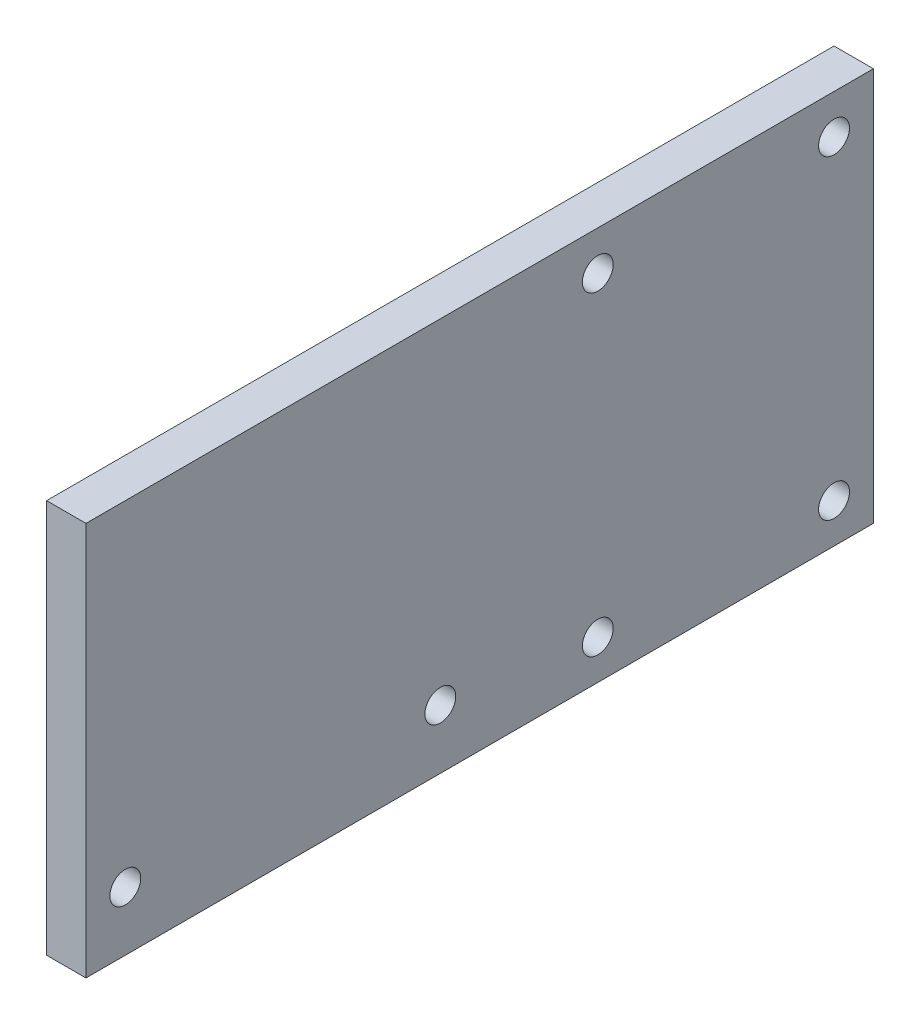
ISO-10303-21;
HEADER;
FILE_DESCRIPTION(('STEP AP214'),'2;1');
FILE_NAME('part.step','',(''),(''),'','','');
FILE_SCHEMA(('AUTOMOTIVE_DESIGN { 1 0 10303 214 1 1 1 1 }'));
ENDSEC;
DATA;
#1=APPLICATION_CONTEXT('core data for automotive mechanical design processes');
#2=APPLICATION_PROTOCOL_DEFINITION('international standard','automotive_design',2000,#1);
#3=PRODUCT_CONTEXT('',#1,'mechanical');
#4=PRODUCT('Part','Part','',(#3));
#5=PRODUCT_RELATED_PRODUCT_CATEGORY('part','',(#4));
#6=PRODUCT_DEFINITION_FORMATION('','',#4);
#7=PRODUCT_DEFINITION_CONTEXT('part definition',#1,'design');
#8=PRODUCT_DEFINITION('design','',#6,#7);
#9=PRODUCT_DEFINITION_SHAPE('','',#8);
#10=(LENGTH_UNIT() NAMED_UNIT(*) SI_UNIT(.MILLI.,.METRE.));
#11=(NAMED_UNIT(*) PLANE_ANGLE_UNIT() SI_UNIT($,.RADIAN.));
#12=(NAMED_UNIT(*) SI_UNIT($,.STERADIAN.) SOLID_ANGLE_UNIT());
#13=UNCERTAINTY_MEASURE_WITH_UNIT(LENGTH_MEASURE(1.E-05),#10,'distance_accuracy_value','');
#14=(GEOMETRIC_REPRESENTATION_CONTEXT(3) GLOBAL_UNCERTAINTY_ASSIGNED_CONTEXT((#13)) GLOBAL_UNIT_ASSIGNED_CONTEXT((#10,
#11,#12)) REPRESENTATION_CONTEXT('',''));
#15=CARTESIAN_POINT('',(0.,0.,0.));
#16=DIRECTION('',(0.,0.,1.));
#17=DIRECTION('',(1.,0.,0.));
#18=AXIS2_PLACEMENT_3D('',#15,#16,#17);
#19=CARTESIAN_POINT('',(6.35,-31.75,-63.5));
#20=DIRECTION('',(0.,0.,1.));
#21=DIRECTION('',(1.,0.,0.));
#22=AXIS2_PLACEMENT_3D('',#19,#20,#21);
#23=PLANE('',#22);
#24=DIRECTION('',(0.,1.,0.));
#25=VECTOR('',#24,1.);
#26=CARTESIAN_POINT('',(0.,-31.75,-63.5));
#27=LINE('',#26,#25);
#28=CARTESIAN_POINT('',(0.,-31.75,-63.5));
#29=VERTEX_POINT('',#28);
#30=CARTESIAN_POINT('',(0.,31.75,-63.5));
#31=VERTEX_POINT('',#30);
#32=EDGE_CURVE('E98',#29,#31,#27,.T.);
#33=ORIENTED_EDGE('',*,*,#32,.T.);
#34=DIRECTION('',(-1.,0.,0.));
#35=VECTOR('',#34,1.);
#36=CARTESIAN_POINT('',(6.35,31.75,-63.5));
#37=LINE('',#36,#35);
#38=CARTESIAN_POINT('',(6.35,31.75,-63.5));
#39=VERTEX_POINT('',#38);
#40=EDGE_CURVE('E11',#39,#31,#37,.T.);
#41=ORIENTED_EDGE('',*,*,#40,.F.);
#42=DIRECTION('',(0.,1.,0.));
#43=VECTOR('',#42,1.);
#44=CARTESIAN_POINT('',(6.35,-31.75,-63.5));
#45=LINE('',#44,#43);
#46=CARTESIAN_POINT('',(6.35,-31.75,-63.5));
#47=VERTEX_POINT('',#46);
#48=EDGE_CURVE('E85',#47,#39,#45,.T.);
#49=ORIENTED_EDGE('',*,*,#48,.F.);
#50=DIRECTION('',(-1.,0.,0.));
#51=VECTOR('',#50,1.);
#52=CARTESIAN_POINT('',(6.35,-31.75,-63.5));
#53=LINE('',#52,#51);
#54=EDGE_CURVE('E94',#47,#29,#53,.T.);
#55=ORIENTED_EDGE('',*,*,#54,.T.);
#56=EDGE_LOOP('',(#33,#41,#49,#55));
#57=FACE_BOUND('',#56,.T.);
#58=ADVANCED_FACE('F33',(#57),#23,.F.);
#59=CARTESIAN_POINT('',(6.35,31.75,63.5));
#60=DIRECTION('',(0.,-1.,0.));
#61=DIRECTION('',(0.,0.,-1.));
#62=AXIS2_PLACEMENT_3D('',#59,#60,#61);
#63=PLANE('',#62);
#64=DIRECTION('',(0.,0.,1.));
#65=VECTOR('',#64,1.);
#66=CARTESIAN_POINT('',(0.,31.75,63.5));
#67=LINE('',#66,#65);
#68=CARTESIAN_POINT('',(0.,31.75,63.5));
#69=VERTEX_POINT('',#68);
#70=EDGE_CURVE('E89',#31,#69,#67,.T.);
#71=ORIENTED_EDGE('',*,*,#70,.T.);
#72=DIRECTION('',(-1.,0.,0.));
#73=VECTOR('',#72,1.);
#74=CARTESIAN_POINT('',(6.35,31.75,63.5));
#75=LINE('',#74,#73);
#76=CARTESIAN_POINT('',(6.35,31.75,63.5));
#77=VERTEX_POINT('',#76);
#78=EDGE_CURVE('E42',#77,#69,#75,.T.);
#79=ORIENTED_EDGE('',*,*,#78,.F.);
#80=DIRECTION('',(0.,0.,1.));
#81=VECTOR('',#80,1.);
#82=CARTESIAN_POINT('',(6.35,31.75,63.5));
#83=LINE('',#82,#81);
#84=EDGE_CURVE('E80',#39,#77,#83,.T.);
#85=ORIENTED_EDGE('',*,*,#84,.F.);
#86=ORIENTED_EDGE('',*,*,#40,.T.);
#87=EDGE_LOOP('',(#71,#79,#85,#86));
#88=FACE_BOUND('',#87,.T.);
#89=ADVANCED_FACE('F88',(#88),#63,.F.);
#90=CARTESIAN_POINT('',(6.35,-31.75,63.5));
#91=DIRECTION('',(0.,0.,-1.));
#92=DIRECTION('',(-1.,0.,0.));
#93=AXIS2_PLACEMENT_3D('',#90,#91,#92);
#94=PLANE('',#93);
#95=DIRECTION('',(0.,-1.,0.));
#96=VECTOR('',#95,1.);
#97=CARTESIAN_POINT('',(0.,-31.75,63.5));
#98=LINE('',#97,#96);
#99=CARTESIAN_POINT('',(0.,-31.75,63.5));
#100=VERTEX_POINT('',#99);
#101=EDGE_CURVE('E67',#69,#100,#98,.T.);
#102=ORIENTED_EDGE('',*,*,#101,.T.);
#103=DIRECTION('',(-1.,0.,0.));
#104=VECTOR('',#103,1.);
#105=CARTESIAN_POINT('',(6.35,-31.75,63.5));
#106=LINE('',#105,#104);
#107=CARTESIAN_POINT('',(6.35,-31.75,63.5));
#108=VERTEX_POINT('',#107);
#109=EDGE_CURVE('E90',#108,#100,#106,.T.);
#110=ORIENTED_EDGE('',*,*,#109,.F.);
#111=DIRECTION('',(0.,-1.,0.));
#112=VECTOR('',#111,1.);
#113=CARTESIAN_POINT('',(6.35,-31.75,63.5));
#114=LINE('',#113,#112);
#115=EDGE_CURVE('E83',#77,#108,#114,.T.);
#116=ORIENTED_EDGE('',*,*,#115,.F.);
#117=ORIENTED_EDGE('',*,*,#78,.T.);
#118=EDGE_LOOP('',(#102,#110,#116,#117));
#119=FACE_BOUND('',#118,.T.);
#120=ADVANCED_FACE('F92',(#119),#94,.F.);
#121=CARTESIAN_POINT('',(6.35,-31.75,63.5));
#122=DIRECTION('',(0.,1.,0.));
#123=DIRECTION('',(0.,0.,1.));
#124=AXIS2_PLACEMENT_3D('',#121,#122,#123);
#125=PLANE('',#124);
#126=DIRECTION('',(0.,0.,-1.));
#127=VECTOR('',#126,1.);
#128=CARTESIAN_POINT('',(0.,-31.75,63.5));
#129=LINE('',#128,#127);
#130=EDGE_CURVE('E73',#100,#29,#129,.T.);
#131=ORIENTED_EDGE('',*,*,#130,.T.);
#132=ORIENTED_EDGE('',*,*,#54,.F.);
#133=DIRECTION('',(0.,0.,-1.));
#134=VECTOR('',#133,1.);
#135=CARTESIAN_POINT('',(6.35,-31.75,63.5));
#136=LINE('',#135,#134);
#137=EDGE_CURVE('E50',#108,#47,#136,.T.);
#138=ORIENTED_EDGE('',*,*,#137,.F.);
#139=ORIENTED_EDGE('',*,*,#109,.T.);
#140=EDGE_LOOP('',(#131,#132,#138,#139));
#141=FACE_BOUND('',#140,.T.);
#142=ADVANCED_FACE('F105',(#141),#125,.F.);
#143=CARTESIAN_POINT('',(6.35,0.,0.));
#144=DIRECTION('',(-1.,0.,0.));
#145=DIRECTION('',(0.,0.,1.));
#146=AXIS2_PLACEMENT_3D('',#143,#144,#145);
#147=PLANE('',#146);
#148=CARTESIAN_POINT('',(6.35,-25.4,-57.15));
#149=DIRECTION('',(-1.,0.,0.));
#150=DIRECTION('',(0.,0.,1.));
#151=AXIS2_PLACEMENT_3D('',#148,#149,#150);
#152=CIRCLE('',#151,2.48919999999999);
#153=CARTESIAN_POINT('',(6.35,-25.4,-54.6608));
#154=VERTEX_POINT('',#153);
#155=EDGE_CURVE('E138',#154,#154,#152,.T.);
#156=ORIENTED_EDGE('',*,*,#155,.T.);
#157=EDGE_LOOP('',(#156));
#158=FACE_BOUND('',#157,.T.);
#159=CARTESIAN_POINT('',(6.35,-25.4,-19.05));
#160=DIRECTION('',(-1.,0.,0.));
#161=DIRECTION('',(0.,0.,1.));
#162=AXIS2_PLACEMENT_3D('',#159,#160,#161);
#163=CIRCLE('',#162,2.48919999999998);
#164=CARTESIAN_POINT('',(6.35,-25.4,-16.5608));
#165=VERTEX_POINT('',#164);
#166=EDGE_CURVE('E132',#165,#165,#163,.T.);
#167=ORIENTED_EDGE('',*,*,#166,.T.);
#168=EDGE_LOOP('',(#167));
#169=FACE_BOUND('',#168,.T.);
#170=CARTESIAN_POINT('',(6.35,25.4,-19.05));
#171=DIRECTION('',(-1.,0.,0.));
#172=DIRECTION('',(0.,0.,1.));
#173=AXIS2_PLACEMENT_3D('',#170,#171,#172);
#174=CIRCLE('',#173,2.48919999999998);
#175=CARTESIAN_POINT('',(6.35,25.4,-16.5608));
#176=VERTEX_POINT('',#175);
#177=EDGE_CURVE('E126',#176,#176,#174,.T.);
#178=ORIENTED_EDGE('',*,*,#177,.T.);
#179=EDGE_LOOP('',(#178));
#180=FACE_BOUND('',#179,.T.);
#181=CARTESIAN_POINT('',(6.35,25.4,-57.15));
#182=DIRECTION('',(-1.,0.,0.));
#183=DIRECTION('',(0.,0.,1.));
#184=AXIS2_PLACEMENT_3D('',#181,#182,#183);
#185=CIRCLE('',#184,2.48919999999999);
#186=CARTESIAN_POINT('',(6.35,25.4,-54.6608));
#187=VERTEX_POINT('',#186);
#188=EDGE_CURVE('E120',#187,#187,#185,.T.);
#189=ORIENTED_EDGE('',*,*,#188,.T.);
#190=EDGE_LOOP('',(#189));
#191=FACE_BOUND('',#190,.T.);
#192=CARTESIAN_POINT('',(6.35,-22.225,57.15));
#193=DIRECTION('',(-1.,0.,0.));
#194=DIRECTION('',(0.,0.,1.));
#195=AXIS2_PLACEMENT_3D('',#192,#193,#194);
#196=CIRCLE('',#195,2.48919999999999);
#197=CARTESIAN_POINT('',(6.35,-22.225,59.6392));
#198=VERTEX_POINT('',#197);
#199=EDGE_CURVE('E114',#198,#198,#196,.T.);
#200=ORIENTED_EDGE('',*,*,#199,.T.);
#201=EDGE_LOOP('',(#200));
#202=FACE_BOUND('',#201,.T.);
#203=CARTESIAN_POINT('',(6.35,-22.225,6.35000000000003));
#204=DIRECTION('',(-1.,0.,0.));
#205=DIRECTION('',(0.,0.,1.));
#206=AXIS2_PLACEMENT_3D('',#203,#204,#205);
#207=CIRCLE('',#206,2.48919999999999);
#208=CARTESIAN_POINT('',(6.35,-22.225,8.83920000000002));
#209=VERTEX_POINT('',#208);
#210=EDGE_CURVE('E36',#209,#209,#207,.T.);
#211=ORIENTED_EDGE('',*,*,#210,.T.);
#212=EDGE_LOOP('',(#211));
#213=FACE_BOUND('',#212,.T.);
#214=ORIENTED_EDGE('',*,*,#48,.T.);
#215=ORIENTED_EDGE('',*,*,#84,.T.);
#216=ORIENTED_EDGE('',*,*,#115,.T.);
#217=ORIENTED_EDGE('',*,*,#137,.T.);
#218=EDGE_LOOP('',(#214,#215,#216,#217));
#219=FACE_BOUND('',#218,.T.);
#220=ADVANCED_FACE('F81',(#158,#169,#180,#191,#202,#213,#219),#147,.F.);
#221=CARTESIAN_POINT('',(0.,0.,0.));
#222=DIRECTION('',(-1.,0.,0.));
#223=DIRECTION('',(0.,0.,1.));
#224=AXIS2_PLACEMENT_3D('',#221,#222,#223);
#225=PLANE('',#224);
#226=CARTESIAN_POINT('',(0.,-25.4,-57.15));
#227=DIRECTION('',(-1.,0.,0.));
#228=DIRECTION('',(0.,0.,1.));
#229=AXIS2_PLACEMENT_3D('',#226,#227,#228);
#230=CIRCLE('',#229,2.48919999999999);
#231=CARTESIAN_POINT('',(0.,-25.4,-54.6608));
#232=VERTEX_POINT('',#231);
#233=EDGE_CURVE('E141',#232,#232,#230,.T.);
#234=ORIENTED_EDGE('',*,*,#233,.F.);
#235=EDGE_LOOP('',(#234));
#236=FACE_BOUND('',#235,.T.);
#237=CARTESIAN_POINT('',(0.,-25.4,-19.05));
#238=DIRECTION('',(-1.,0.,0.));
#239=DIRECTION('',(0.,0.,1.));
#240=AXIS2_PLACEMENT_3D('',#237,#238,#239);
#241=CIRCLE('',#240,2.48919999999999);
#242=CARTESIAN_POINT('',(0.,-25.4,-16.5608));
#243=VERTEX_POINT('',#242);
#244=EDGE_CURVE('E135',#243,#243,#241,.T.);
#245=ORIENTED_EDGE('',*,*,#244,.F.);
#246=EDGE_LOOP('',(#245));
#247=FACE_BOUND('',#246,.T.);
#248=CARTESIAN_POINT('',(0.,25.4,-19.05));
#249=DIRECTION('',(-1.,0.,0.));
#250=DIRECTION('',(0.,0.,1.));
#251=AXIS2_PLACEMENT_3D('',#248,#249,#250);
#252=CIRCLE('',#251,2.48919999999999);
#253=CARTESIAN_POINT('',(0.,25.4,-16.5608));
#254=VERTEX_POINT('',#253);
#255=EDGE_CURVE('E129',#254,#254,#252,.T.);
#256=ORIENTED_EDGE('',*,*,#255,.F.);
#257=EDGE_LOOP('',(#256));
#258=FACE_BOUND('',#257,.T.);
#259=CARTESIAN_POINT('',(0.,25.4,-57.15));
#260=DIRECTION('',(-1.,0.,0.));
#261=DIRECTION('',(0.,0.,1.));
#262=AXIS2_PLACEMENT_3D('',#259,#260,#261);
#263=CIRCLE('',#262,2.48919999999999);
#264=CARTESIAN_POINT('',(0.,25.4,-54.6608));
#265=VERTEX_POINT('',#264);
#266=EDGE_CURVE('E123',#265,#265,#263,.T.);
#267=ORIENTED_EDGE('',*,*,#266,.F.);
#268=EDGE_LOOP('',(#267));
#269=FACE_BOUND('',#268,.T.);
#270=CARTESIAN_POINT('',(0.,-22.225,57.15));
#271=DIRECTION('',(-1.,0.,0.));
#272=DIRECTION('',(0.,0.,1.));
#273=AXIS2_PLACEMENT_3D('',#270,#271,#272);
#274=CIRCLE('',#273,2.48919999999999);
#275=CARTESIAN_POINT('',(0.,-22.225,59.6392));
#276=VERTEX_POINT('',#275);
#277=EDGE_CURVE('E117',#276,#276,#274,.T.);
#278=ORIENTED_EDGE('',*,*,#277,.F.);
#279=EDGE_LOOP('',(#278));
#280=FACE_BOUND('',#279,.T.);
#281=CARTESIAN_POINT('',(0.,-22.225,6.35000000000003));
#282=DIRECTION('',(-1.,0.,0.));
#283=DIRECTION('',(0.,0.,1.));
#284=AXIS2_PLACEMENT_3D('',#281,#282,#283);
#285=CIRCLE('',#284,2.48919999999999);
#286=CARTESIAN_POINT('',(0.,-22.225,8.83920000000002));
#287=VERTEX_POINT('',#286);
#288=EDGE_CURVE('E111',#287,#287,#285,.T.);
#289=ORIENTED_EDGE('',*,*,#288,.F.);
#290=EDGE_LOOP('',(#289));
#291=FACE_BOUND('',#290,.T.);
#292=ORIENTED_EDGE('',*,*,#32,.F.);
#293=ORIENTED_EDGE('',*,*,#130,.F.);
#294=ORIENTED_EDGE('',*,*,#101,.F.);
#295=ORIENTED_EDGE('',*,*,#70,.F.);
#296=EDGE_LOOP('',(#292,#293,#294,#295));
#297=FACE_BOUND('',#296,.T.);
#298=ADVANCED_FACE('F108',(#236,#247,#258,#269,#280,#291,#297),#225,.T.);
#299=CARTESIAN_POINT('',(0.,-22.225,6.35000000000003));
#300=DIRECTION('',(-1.,0.,0.));
#301=DIRECTION('',(0.,0.,1.));
#302=AXIS2_PLACEMENT_3D('',#299,#300,#301);
#303=CYLINDRICAL_SURFACE('',#302,2.48919999999999);
#304=ORIENTED_EDGE('',*,*,#288,.T.);
#305=EDGE_LOOP('',(#304));
#306=FACE_BOUND('',#305,.T.);
#307=ORIENTED_EDGE('',*,*,#210,.F.);
#308=EDGE_LOOP('',(#307));
#309=FACE_BOUND('',#308,.T.);
#310=ADVANCED_FACE('F150',(#306,#309),#303,.F.);
#311=CARTESIAN_POINT('',(0.,-22.225,57.15));
#312=DIRECTION('',(-1.,0.,0.));
#313=DIRECTION('',(0.,0.,1.));
#314=AXIS2_PLACEMENT_3D('',#311,#312,#313);
#315=CYLINDRICAL_SURFACE('',#314,2.48919999999999);
#316=ORIENTED_EDGE('',*,*,#277,.T.);
#317=EDGE_LOOP('',(#316));
#318=FACE_BOUND('',#317,.T.);
#319=ORIENTED_EDGE('',*,*,#199,.F.);
#320=EDGE_LOOP('',(#319));
#321=FACE_BOUND('',#320,.T.);
#322=ADVANCED_FACE('F164',(#318,#321),#315,.F.);
#323=CARTESIAN_POINT('',(0.,25.4,-57.15));
#324=DIRECTION('',(-1.,0.,0.));
#325=DIRECTION('',(0.,0.,1.));
#326=AXIS2_PLACEMENT_3D('',#323,#324,#325);
#327=CYLINDRICAL_SURFACE('',#326,2.48919999999999);
#328=ORIENTED_EDGE('',*,*,#266,.T.);
#329=EDGE_LOOP('',(#328));
#330=FACE_BOUND('',#329,.T.);
#331=ORIENTED_EDGE('',*,*,#188,.F.);
#332=EDGE_LOOP('',(#331));
#333=FACE_BOUND('',#332,.T.);
#334=ADVANCED_FACE('F207',(#330,#333),#327,.F.);
#335=CARTESIAN_POINT('',(0.,25.4,-19.05));
#336=DIRECTION('',(-1.,0.,0.));
#337=DIRECTION('',(0.,0.,1.));
#338=AXIS2_PLACEMENT_3D('',#335,#336,#337);
#339=CYLINDRICAL_SURFACE('',#338,2.48919999999998);
#340=ORIENTED_EDGE('',*,*,#255,.T.);
#341=EDGE_LOOP('',(#340));
#342=FACE_BOUND('',#341,.T.);
#343=ORIENTED_EDGE('',*,*,#177,.F.);
#344=EDGE_LOOP('',(#343));
#345=FACE_BOUND('',#344,.T.);
#346=ADVANCED_FACE('F226',(#342,#345),#339,.F.);
#347=CARTESIAN_POINT('',(0.,-25.4,-19.05));
#348=DIRECTION('',(-1.,0.,0.));
#349=DIRECTION('',(0.,0.,1.));
#350=AXIS2_PLACEMENT_3D('',#347,#348,#349);
#351=CYLINDRICAL_SURFACE('',#350,2.48919999999998);
#352=ORIENTED_EDGE('',*,*,#244,.T.);
#353=EDGE_LOOP('',(#352));
#354=FACE_BOUND('',#353,.T.);
#355=ORIENTED_EDGE('',*,*,#166,.F.);
#356=EDGE_LOOP('',(#355));
#357=FACE_BOUND('',#356,.T.);
#358=ADVANCED_FACE('F236',(#354,#357),#351,.F.);
#359=CARTESIAN_POINT('',(0.,-25.4,-57.15));
#360=DIRECTION('',(-1.,0.,0.));
#361=DIRECTION('',(0.,0.,1.));
#362=AXIS2_PLACEMENT_3D('',#359,#360,#361);
#363=CYLINDRICAL_SURFACE('',#362,2.48919999999999);
#364=ORIENTED_EDGE('',*,*,#233,.T.);
#365=EDGE_LOOP('',(#364));
#366=FACE_BOUND('',#365,.T.);
#367=ORIENTED_EDGE('',*,*,#155,.F.);
#368=EDGE_LOOP('',(#367));
#369=FACE_BOUND('',#368,.T.);
#370=ADVANCED_FACE('F145',(#366,#369),#363,.F.);
#371=CLOSED_SHELL('',(#58,#89,#120,#142,#220,#298,#310,#322,#334,#346,#358,#370));
#372=MANIFOLD_SOLID_BREP('B2',#371);
#373=ADVANCED_BREP_SHAPE_REPRESENTATION('',(#18,#372),#14);
#374=SHAPE_DEFINITION_REPRESENTATION(#9,#373);
ENDSEC;
END-ISO-10303-21;
